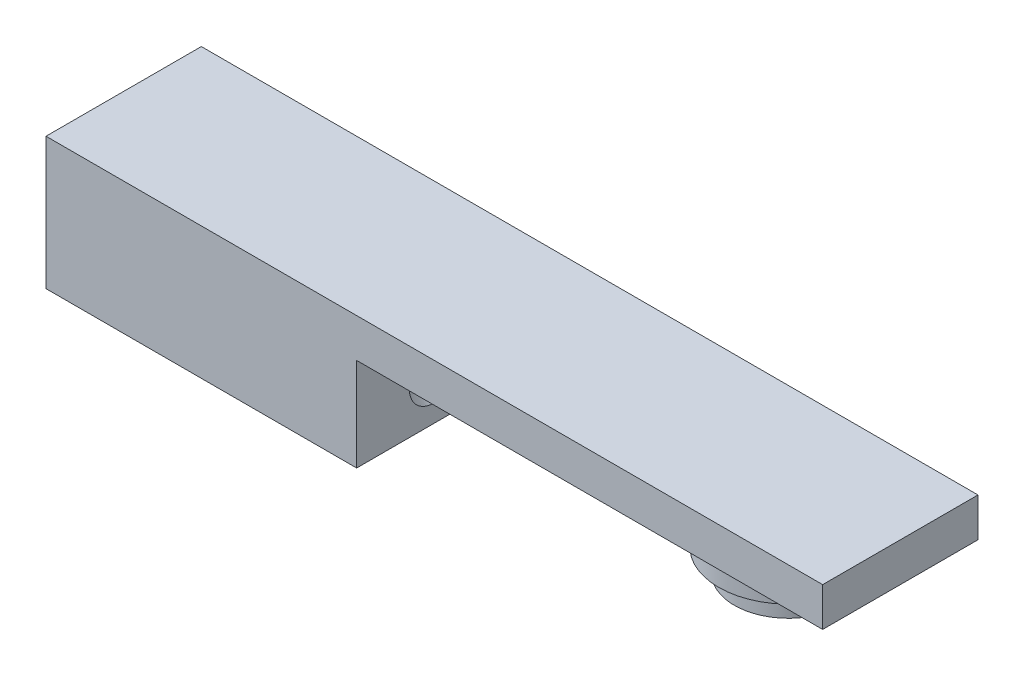
ISO-10303-21;
HEADER;
FILE_DESCRIPTION(('STEP AP214'),'2;1');
FILE_NAME('part.step','',(''),(''),'','','');
FILE_SCHEMA(('AUTOMOTIVE_DESIGN { 1 0 10303 214 1 1 1 1 }'));
ENDSEC;
DATA;
#1=APPLICATION_CONTEXT('core data for automotive mechanical design processes');
#2=APPLICATION_PROTOCOL_DEFINITION('international standard','automotive_design',2000,#1);
#3=PRODUCT_CONTEXT('',#1,'mechanical');
#4=PRODUCT('Part','Part','',(#3));
#5=PRODUCT_RELATED_PRODUCT_CATEGORY('part','',(#4));
#6=PRODUCT_DEFINITION_FORMATION('','',#4);
#7=PRODUCT_DEFINITION_CONTEXT('part definition',#1,'design');
#8=PRODUCT_DEFINITION('design','',#6,#7);
#9=PRODUCT_DEFINITION_SHAPE('','',#8);
#10=(LENGTH_UNIT() NAMED_UNIT(*) SI_UNIT(.MILLI.,.METRE.));
#11=(NAMED_UNIT(*) PLANE_ANGLE_UNIT() SI_UNIT($,.RADIAN.));
#12=(NAMED_UNIT(*) SI_UNIT($,.STERADIAN.) SOLID_ANGLE_UNIT());
#13=UNCERTAINTY_MEASURE_WITH_UNIT(LENGTH_MEASURE(1.E-05),#10,'distance_accuracy_value','');
#14=(GEOMETRIC_REPRESENTATION_CONTEXT(3) GLOBAL_UNCERTAINTY_ASSIGNED_CONTEXT((#13)) GLOBAL_UNIT_ASSIGNED_CONTEXT((#10,
#11,#12)) REPRESENTATION_CONTEXT('',''));
#15=CARTESIAN_POINT('',(0.,0.,0.));
#16=DIRECTION('',(0.,0.,1.));
#17=DIRECTION('',(1.,0.,0.));
#18=AXIS2_PLACEMENT_3D('',#15,#16,#17);
#19=CARTESIAN_POINT('',(40.,0.,0.));
#20=DIRECTION('',(-1.,0.,0.));
#21=DIRECTION('',(0.,0.,1.));
#22=AXIS2_PLACEMENT_3D('',#19,#20,#21);
#23=PLANE('',#22);
#24=CARTESIAN_POINT('',(40.,7.78411195304329,27.7910248890691));
#25=DIRECTION('',(1.,0.,0.));
#26=DIRECTION('',(0.,0.,-1.));
#27=AXIS2_PLACEMENT_3D('',#24,#25,#26);
#28=CIRCLE('',#27,3.15);
#29=CARTESIAN_POINT('',(40.,7.78411195304329,24.6410248890692));
#30=VERTEX_POINT('',#29);
#31=EDGE_CURVE('E183',#30,#30,#28,.T.);
#32=ORIENTED_EDGE('',*,*,#31,.F.);
#33=EDGE_LOOP('',(#32));
#34=FACE_BOUND('',#33,.T.);
#35=DIRECTION('',(0.,0.,-1.));
#36=VECTOR('',#35,1.);
#37=CARTESIAN_POINT('',(40.,14.3609885177324,37.7241266195551));
#38=LINE('',#37,#36);
#39=CARTESIAN_POINT('',(40.,14.3609885177324,37.7241266195551));
#40=VERTEX_POINT('',#39);
#41=CARTESIAN_POINT('',(40.,14.3609885177324,17.7241266195551));
#42=VERTEX_POINT('',#41);
#43=EDGE_CURVE('E48',#40,#42,#38,.T.);
#44=ORIENTED_EDGE('',*,*,#43,.F.);
#45=DIRECTION('',(0.,-1.,0.));
#46=VECTOR('',#45,1.);
#47=CARTESIAN_POINT('',(40.,2.36098851773249,37.7241266195551));
#48=LINE('',#47,#46);
#49=CARTESIAN_POINT('',(40.,2.36098851773249,37.7241266195551));
#50=VERTEX_POINT('',#49);
#51=EDGE_CURVE('E85',#40,#50,#48,.T.);
#52=ORIENTED_EDGE('',*,*,#51,.T.);
#53=DIRECTION('',(0.,0.,-1.));
#54=VECTOR('',#53,1.);
#55=CARTESIAN_POINT('',(40.,2.36098851773249,37.7241266195551));
#56=LINE('',#55,#54);
#57=CARTESIAN_POINT('',(40.,2.36098851773249,17.7241266195551));
#58=VERTEX_POINT('',#57);
#59=EDGE_CURVE('E54',#50,#58,#56,.T.);
#60=ORIENTED_EDGE('',*,*,#59,.T.);
#61=DIRECTION('',(0.,1.,0.));
#62=VECTOR('',#61,1.);
#63=CARTESIAN_POINT('',(40.,2.36098851773249,17.7241266195551));
#64=LINE('',#63,#62);
#65=EDGE_CURVE('E96',#58,#42,#64,.T.);
#66=ORIENTED_EDGE('',*,*,#65,.T.);
#67=EDGE_LOOP('',(#44,#52,#60,#66));
#68=FACE_BOUND('',#67,.T.);
#69=ADVANCED_FACE('F33',(#34,#68),#23,.F.);
#70=CARTESIAN_POINT('',(40.,2.36098851773249,37.7241266195551));
#71=DIRECTION('',(0.,0.,-1.));
#72=DIRECTION('',(-1.,0.,0.));
#73=AXIS2_PLACEMENT_3D('',#70,#71,#72);
#74=PLANE('',#73);
#75=DIRECTION('',(0.,-1.,0.));
#76=VECTOR('',#75,1.);
#77=CARTESIAN_POINT('',(0.,2.36098851773249,37.7241266195551));
#78=LINE('',#77,#76);
#79=CARTESIAN_POINT('',(0.,19.3609885177324,37.7241266195551));
#80=VERTEX_POINT('',#79);
#81=CARTESIAN_POINT('',(0.,2.36098851773249,37.7241266195551));
#82=VERTEX_POINT('',#81);
#83=EDGE_CURVE('E92',#80,#82,#78,.T.);
#84=ORIENTED_EDGE('',*,*,#83,.T.);
#85=DIRECTION('',(-1.,0.,0.));
#86=VECTOR('',#85,1.);
#87=CARTESIAN_POINT('',(40.,2.36098851773249,37.7241266195551));
#88=LINE('',#87,#86);
#89=EDGE_CURVE('E41',#50,#82,#88,.T.);
#90=ORIENTED_EDGE('',*,*,#89,.F.);
#91=ORIENTED_EDGE('',*,*,#51,.F.);
#92=DIRECTION('',(-1.,0.,0.));
#93=VECTOR('',#92,1.);
#94=CARTESIAN_POINT('',(100.,14.3609885177324,37.7241266195551));
#95=LINE('',#94,#93);
#96=CARTESIAN_POINT('',(100.,14.3609885177324,37.7241266195551));
#97=VERTEX_POINT('',#96);
#98=EDGE_CURVE('E101',#97,#40,#95,.T.);
#99=ORIENTED_EDGE('',*,*,#98,.F.);
#100=DIRECTION('',(0.,-1.,0.));
#101=VECTOR('',#100,1.);
#102=CARTESIAN_POINT('',(100.,19.3609885177324,37.7241266195551));
#103=LINE('',#102,#101);
#104=CARTESIAN_POINT('',(100.,19.3609885177324,37.7241266195551));
#105=VERTEX_POINT('',#104);
#106=EDGE_CURVE('E95',#105,#97,#103,.T.);
#107=ORIENTED_EDGE('',*,*,#106,.F.);
#108=DIRECTION('',(-1.,0.,0.));
#109=VECTOR('',#108,1.);
#110=CARTESIAN_POINT('',(40.,19.3609885177324,37.7241266195551));
#111=LINE('',#110,#109);
#112=EDGE_CURVE('E78',#105,#80,#111,.T.);
#113=ORIENTED_EDGE('',*,*,#112,.T.);
#114=EDGE_LOOP('',(#84,#90,#91,#99,#107,#113));
#115=FACE_BOUND('',#114,.T.);
#116=ADVANCED_FACE('F35',(#115),#74,.F.);
#117=CARTESIAN_POINT('',(40.,2.36098851773249,37.7241266195551));
#118=DIRECTION('',(0.,1.,0.));
#119=DIRECTION('',(0.,0.,1.));
#120=AXIS2_PLACEMENT_3D('',#117,#118,#119);
#121=PLANE('',#120);
#122=DIRECTION('',(0.,0.,-1.));
#123=VECTOR('',#122,1.);
#124=CARTESIAN_POINT('',(0.,2.36098851773249,37.7241266195551));
#125=LINE('',#124,#123);
#126=CARTESIAN_POINT('',(0.,2.36098851773249,17.7241266195551));
#127=VERTEX_POINT('',#126);
#128=EDGE_CURVE('E99',#82,#127,#125,.T.);
#129=ORIENTED_EDGE('',*,*,#128,.T.);
#130=DIRECTION('',(-1.,0.,0.));
#131=VECTOR('',#130,1.);
#132=CARTESIAN_POINT('',(40.,2.36098851773249,17.7241266195551));
#133=LINE('',#132,#131);
#134=EDGE_CURVE('E112',#58,#127,#133,.T.);
#135=ORIENTED_EDGE('',*,*,#134,.F.);
#136=ORIENTED_EDGE('',*,*,#59,.F.);
#137=ORIENTED_EDGE('',*,*,#89,.T.);
#138=EDGE_LOOP('',(#129,#135,#136,#137));
#139=FACE_BOUND('',#138,.T.);
#140=ADVANCED_FACE('F115',(#139),#121,.F.);
#141=CARTESIAN_POINT('',(40.,2.36098851773249,17.7241266195551));
#142=DIRECTION('',(0.,0.,1.));
#143=DIRECTION('',(1.,0.,0.));
#144=AXIS2_PLACEMENT_3D('',#141,#142,#143);
#145=PLANE('',#144);
#146=DIRECTION('',(0.,1.,0.));
#147=VECTOR('',#146,1.);
#148=CARTESIAN_POINT('',(0.,2.36098851773249,17.7241266195551));
#149=LINE('',#148,#147);
#150=CARTESIAN_POINT('',(0.,19.3609885177324,17.7241266195551));
#151=VERTEX_POINT('',#150);
#152=EDGE_CURVE('E86',#127,#151,#149,.T.);
#153=ORIENTED_EDGE('',*,*,#152,.T.);
#154=DIRECTION('',(-1.,0.,0.));
#155=VECTOR('',#154,1.);
#156=CARTESIAN_POINT('',(40.,19.3609885177324,17.7241266195551));
#157=LINE('',#156,#155);
#158=CARTESIAN_POINT('',(100.,19.3609885177324,17.7241266195551));
#159=VERTEX_POINT('',#158);
#160=EDGE_CURVE('E81',#159,#151,#157,.T.);
#161=ORIENTED_EDGE('',*,*,#160,.F.);
#162=DIRECTION('',(0.,1.,0.));
#163=VECTOR('',#162,1.);
#164=CARTESIAN_POINT('',(100.,19.3609885177324,17.7241266195551));
#165=LINE('',#164,#163);
#166=CARTESIAN_POINT('',(100.,14.3609885177324,17.7241266195551));
#167=VERTEX_POINT('',#166);
#168=EDGE_CURVE('E131',#167,#159,#165,.T.);
#169=ORIENTED_EDGE('',*,*,#168,.F.);
#170=DIRECTION('',(-1.,0.,0.));
#171=VECTOR('',#170,1.);
#172=CARTESIAN_POINT('',(100.,14.3609885177324,17.7241266195551));
#173=LINE('',#172,#171);
#174=EDGE_CURVE('E105',#167,#42,#173,.T.);
#175=ORIENTED_EDGE('',*,*,#174,.T.);
#176=ORIENTED_EDGE('',*,*,#65,.F.);
#177=ORIENTED_EDGE('',*,*,#134,.T.);
#178=EDGE_LOOP('',(#153,#161,#169,#175,#176,#177));
#179=FACE_BOUND('',#178,.T.);
#180=ADVANCED_FACE('F145',(#179),#145,.F.);
#181=CARTESIAN_POINT('',(40.,19.3609885177324,37.7241266195551));
#182=DIRECTION('',(0.,-1.,0.));
#183=DIRECTION('',(0.,0.,-1.));
#184=AXIS2_PLACEMENT_3D('',#181,#182,#183);
#185=PLANE('',#184);
#186=DIRECTION('',(0.,0.,1.));
#187=VECTOR('',#186,1.);
#188=CARTESIAN_POINT('',(0.,19.3609885177324,37.7241266195551));
#189=LINE('',#188,#187);
#190=EDGE_CURVE('E74',#151,#80,#189,.T.);
#191=ORIENTED_EDGE('',*,*,#190,.T.);
#192=ORIENTED_EDGE('',*,*,#112,.F.);
#193=DIRECTION('',(0.,0.,1.));
#194=VECTOR('',#193,1.);
#195=CARTESIAN_POINT('',(100.,19.3609885177324,37.7241266195551));
#196=LINE('',#195,#194);
#197=EDGE_CURVE('E134',#159,#105,#196,.T.);
#198=ORIENTED_EDGE('',*,*,#197,.F.);
#199=ORIENTED_EDGE('',*,*,#160,.T.);
#200=EDGE_LOOP('',(#191,#192,#198,#199));
#201=FACE_BOUND('',#200,.T.);
#202=ADVANCED_FACE('F76',(#201),#185,.F.);
#203=CARTESIAN_POINT('',(0.,0.,0.));
#204=DIRECTION('',(-1.,0.,0.));
#205=DIRECTION('',(0.,0.,1.));
#206=AXIS2_PLACEMENT_3D('',#203,#204,#205);
#207=PLANE('',#206);
#208=CARTESIAN_POINT('',(0.,7.78411195304329,27.7910248890691));
#209=DIRECTION('',(1.,0.,0.));
#210=DIRECTION('',(0.,0.,-1.));
#211=AXIS2_PLACEMENT_3D('',#208,#209,#210);
#212=CIRCLE('',#211,1.69999999999998);
#213=CARTESIAN_POINT('',(0.,7.78411195304329,26.0910248890692));
#214=VERTEX_POINT('',#213);
#215=EDGE_CURVE('E175',#214,#214,#212,.T.);
#216=ORIENTED_EDGE('',*,*,#215,.T.);
#217=EDGE_LOOP('',(#216));
#218=FACE_BOUND('',#217,.T.);
#219=ORIENTED_EDGE('',*,*,#83,.F.);
#220=ORIENTED_EDGE('',*,*,#190,.F.);
#221=ORIENTED_EDGE('',*,*,#152,.F.);
#222=ORIENTED_EDGE('',*,*,#128,.F.);
#223=EDGE_LOOP('',(#219,#220,#221,#222));
#224=FACE_BOUND('',#223,.T.);
#225=ADVANCED_FACE('F98',(#218,#224),#207,.T.);
#226=CARTESIAN_POINT('',(100.,14.3609885177324,37.7241266195551));
#227=DIRECTION('',(0.,1.,0.));
#228=DIRECTION('',(0.,0.,1.));
#229=AXIS2_PLACEMENT_3D('',#226,#227,#228);
#230=PLANE('',#229);
#231=CARTESIAN_POINT('',(85.6202343826868,14.3609885177324,27.7241266195551));
#232=DIRECTION('',(0.,1.,0.));
#233=DIRECTION('',(0.,0.,1.));
#234=AXIS2_PLACEMENT_3D('',#231,#232,#233);
#235=CIRCLE('',#234,9.);
#236=CARTESIAN_POINT('',(85.6202343826868,14.3609885177324,36.7241266195551));
#237=VERTEX_POINT('',#236);
#238=EDGE_CURVE('E11',#237,#237,#235,.F.);
#239=ORIENTED_EDGE('',*,*,#238,.F.);
#240=EDGE_LOOP('',(#239));
#241=FACE_BOUND('',#240,.T.);
#242=ORIENTED_EDGE('',*,*,#43,.T.);
#243=ORIENTED_EDGE('',*,*,#174,.F.);
#244=DIRECTION('',(0.,0.,-1.));
#245=VECTOR('',#244,1.);
#246=CARTESIAN_POINT('',(100.,14.3609885177324,37.7241266195551));
#247=LINE('',#246,#245);
#248=EDGE_CURVE('E125',#97,#167,#247,.T.);
#249=ORIENTED_EDGE('',*,*,#248,.F.);
#250=ORIENTED_EDGE('',*,*,#98,.T.);
#251=EDGE_LOOP('',(#242,#243,#249,#250));
#252=FACE_BOUND('',#251,.T.);
#253=ADVANCED_FACE('F120',(#241,#252),#230,.F.);
#254=CARTESIAN_POINT('',(100.,0.,0.));
#255=DIRECTION('',(1.,0.,0.));
#256=DIRECTION('',(0.,0.,-1.));
#257=AXIS2_PLACEMENT_3D('',#254,#255,#256);
#258=PLANE('',#257);
#259=ORIENTED_EDGE('',*,*,#106,.T.);
#260=ORIENTED_EDGE('',*,*,#248,.T.);
#261=ORIENTED_EDGE('',*,*,#168,.T.);
#262=ORIENTED_EDGE('',*,*,#197,.T.);
#263=EDGE_LOOP('',(#259,#260,#261,#262));
#264=FACE_BOUND('',#263,.T.);
#265=ADVANCED_FACE('F133',(#264),#258,.T.);
#266=CARTESIAN_POINT('',(85.6202343826868,11.3609885177324,27.7241266195551));
#267=DIRECTION('',(0.,1.,0.));
#268=DIRECTION('',(0.,0.,1.));
#269=AXIS2_PLACEMENT_3D('',#266,#267,#268);
#270=CYLINDRICAL_SURFACE('',#269,9.);
#271=CARTESIAN_POINT('',(85.6202343826868,11.3609885177324,27.7241266195551));
#272=DIRECTION('',(0.,-1.,0.));
#273=DIRECTION('',(0.,0.,-1.));
#274=AXIS2_PLACEMENT_3D('',#271,#272,#273);
#275=CIRCLE('',#274,9.);
#276=CARTESIAN_POINT('',(85.6202343826868,11.3609885177324,18.7241266195551));
#277=VERTEX_POINT('',#276);
#278=EDGE_CURVE('E136',#277,#277,#275,.T.);
#279=ORIENTED_EDGE('',*,*,#278,.F.);
#280=EDGE_LOOP('',(#279));
#281=FACE_BOUND('',#280,.T.);
#282=ORIENTED_EDGE('',*,*,#238,.T.);
#283=EDGE_LOOP('',(#282));
#284=FACE_BOUND('',#283,.T.);
#285=ADVANCED_FACE('F195',(#281,#284),#270,.T.);
#286=CARTESIAN_POINT('',(85.6202343826868,11.3609885177324,27.7241266195551));
#287=DIRECTION('',(0.,-1.,0.));
#288=DIRECTION('',(0.,0.,-1.));
#289=AXIS2_PLACEMENT_3D('',#286,#287,#288);
#290=PLANE('',#289);
#291=CARTESIAN_POINT('',(85.6202343826868,11.3609885177324,27.7241266195551));
#292=DIRECTION('',(0.,-1.,0.));
#293=DIRECTION('',(0.,0.,-1.));
#294=AXIS2_PLACEMENT_3D('',#291,#292,#293);
#295=CIRCLE('',#294,7.);
#296=CARTESIAN_POINT('',(85.6202343826868,11.3609885177324,20.7241266195551));
#297=VERTEX_POINT('',#296);
#298=EDGE_CURVE('E177',#297,#297,#295,.T.);
#299=ORIENTED_EDGE('',*,*,#298,.F.);
#300=EDGE_LOOP('',(#299));
#301=FACE_BOUND('',#300,.T.);
#302=ORIENTED_EDGE('',*,*,#278,.T.);
#303=EDGE_LOOP('',(#302));
#304=FACE_BOUND('',#303,.T.);
#305=ADVANCED_FACE('F193',(#301,#304),#290,.T.);
#306=CARTESIAN_POINT('',(85.6202343826868,8.36098851773238,27.7241266195551));
#307=DIRECTION('',(0.,1.,0.));
#308=DIRECTION('',(0.,0.,1.));
#309=AXIS2_PLACEMENT_3D('',#306,#307,#308);
#310=CYLINDRICAL_SURFACE('',#309,7.);
#311=CARTESIAN_POINT('',(85.6202343826868,8.36098851773238,27.7241266195551));
#312=DIRECTION('',(0.,-1.,0.));
#313=DIRECTION('',(0.,0.,-1.));
#314=AXIS2_PLACEMENT_3D('',#311,#312,#313);
#315=CIRCLE('',#314,7.);
#316=CARTESIAN_POINT('',(85.6202343826868,8.36098851773238,20.7241266195551));
#317=VERTEX_POINT('',#316);
#318=EDGE_CURVE('E181',#317,#317,#315,.T.);
#319=ORIENTED_EDGE('',*,*,#318,.F.);
#320=EDGE_LOOP('',(#319));
#321=FACE_BOUND('',#320,.T.);
#322=ORIENTED_EDGE('',*,*,#298,.T.);
#323=EDGE_LOOP('',(#322));
#324=FACE_BOUND('',#323,.T.);
#325=ADVANCED_FACE('F204',(#321,#324),#310,.T.);
#326=CARTESIAN_POINT('',(85.6202343826868,8.36098851773238,27.7241266195551));
#327=DIRECTION('',(0.,-1.,0.));
#328=DIRECTION('',(0.,0.,-1.));
#329=AXIS2_PLACEMENT_3D('',#326,#327,#328);
#330=PLANE('',#329);
#331=ORIENTED_EDGE('',*,*,#318,.T.);
#332=EDGE_LOOP('',(#331));
#333=FACE_BOUND('',#332,.T.);
#334=ADVANCED_FACE('F210',(#333),#330,.T.);
#335=CARTESIAN_POINT('',(40.,7.78411195304329,27.7910248890691));
#336=DIRECTION('',(1.,0.,0.));
#337=DIRECTION('',(0.,0.,-1.));
#338=AXIS2_PLACEMENT_3D('',#335,#336,#337);
#339=CYLINDRICAL_SURFACE('',#338,1.69999999999999);
#340=ORIENTED_EDGE('',*,*,#215,.F.);
#341=EDGE_LOOP('',(#340));
#342=FACE_BOUND('',#341,.T.);
#343=CARTESIAN_POINT('',(38.55,7.78411195304329,27.7910248890691));
#344=DIRECTION('',(1.,0.,0.));
#345=DIRECTION('',(0.,0.,-1.));
#346=AXIS2_PLACEMENT_3D('',#343,#344,#345);
#347=CIRCLE('',#346,1.69999999999999);
#348=CARTESIAN_POINT('',(38.55,7.78411195304329,26.0910248890692));
#349=VERTEX_POINT('',#348);
#350=EDGE_CURVE('E178',#349,#349,#347,.T.);
#351=ORIENTED_EDGE('',*,*,#350,.T.);
#352=EDGE_LOOP('',(#351));
#353=FACE_BOUND('',#352,.T.);
#354=ADVANCED_FACE('F214',(#342,#353),#339,.F.);
#355=CARTESIAN_POINT('',(40.,7.78411195304329,27.7910248890691));
#356=DIRECTION('',(1.,0.,0.));
#357=DIRECTION('',(0.,0.,-1.));
#358=AXIS2_PLACEMENT_3D('',#355,#356,#357);
#359=CONICAL_SURFACE('',#358,3.15,0.78539816339745);
#360=ORIENTED_EDGE('',*,*,#350,.F.);
#361=EDGE_LOOP('',(#360));
#362=FACE_BOUND('',#361,.T.);
#363=ORIENTED_EDGE('',*,*,#31,.T.);
#364=EDGE_LOOP('',(#363));
#365=FACE_BOUND('',#364,.T.);
#366=ADVANCED_FACE('F217',(#362,#365),#359,.F.);
#367=CLOSED_SHELL('',(#69,#116,#140,#180,#202,#225,#253,#265,#285,#305,#325,#334,#354,#366));
#368=MANIFOLD_SOLID_BREP('B2',#367);
#369=ADVANCED_BREP_SHAPE_REPRESENTATION('',(#18,#368),#14);
#370=SHAPE_DEFINITION_REPRESENTATION(#9,#369);
ENDSEC;
END-ISO-10303-21;
